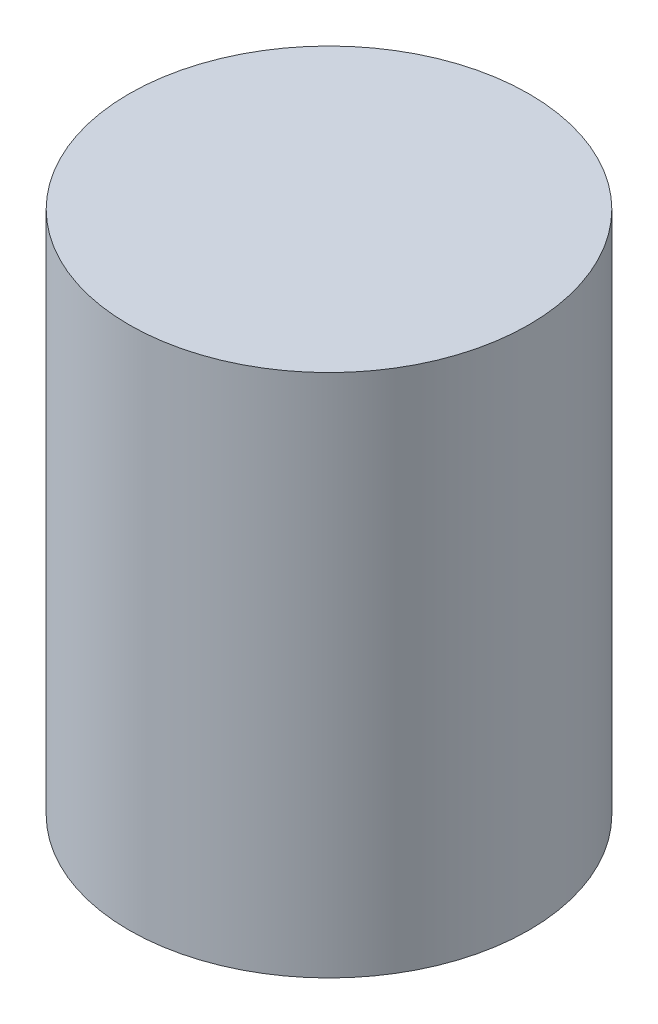
ISO-10303-21;
HEADER;
FILE_DESCRIPTION(('STEP AP214'),'2;1');
FILE_NAME('part.step','',(''),(''),'','','');
FILE_SCHEMA(('AUTOMOTIVE_DESIGN { 1 0 10303 214 1 1 1 1 }'));
ENDSEC;
DATA;
#1=APPLICATION_CONTEXT('core data for automotive mechanical design processes');
#2=APPLICATION_PROTOCOL_DEFINITION('international standard','automotive_design',2000,#1);
#3=PRODUCT_CONTEXT('',#1,'mechanical');
#4=PRODUCT('Part','Part','',(#3));
#5=PRODUCT_RELATED_PRODUCT_CATEGORY('part','',(#4));
#6=PRODUCT_DEFINITION_FORMATION('','',#4);
#7=PRODUCT_DEFINITION_CONTEXT('part definition',#1,'design');
#8=PRODUCT_DEFINITION('design','',#6,#7);
#9=PRODUCT_DEFINITION_SHAPE('','',#8);
#10=(LENGTH_UNIT() NAMED_UNIT(*) SI_UNIT(.MILLI.,.METRE.));
#11=(NAMED_UNIT(*) PLANE_ANGLE_UNIT() SI_UNIT($,.RADIAN.));
#12=(NAMED_UNIT(*) SI_UNIT($,.STERADIAN.) SOLID_ANGLE_UNIT());
#13=UNCERTAINTY_MEASURE_WITH_UNIT(LENGTH_MEASURE(1.E-05),#10,'distance_accuracy_value','');
#14=(GEOMETRIC_REPRESENTATION_CONTEXT(3) GLOBAL_UNCERTAINTY_ASSIGNED_CONTEXT((#13)) GLOBAL_UNIT_ASSIGNED_CONTEXT((#10,
#11,#12)) REPRESENTATION_CONTEXT('',''));
#15=CARTESIAN_POINT('',(0.,0.,0.));
#16=DIRECTION('',(0.,0.,1.));
#17=DIRECTION('',(1.,0.,0.));
#18=AXIS2_PLACEMENT_3D('',#15,#16,#17);
#19=CARTESIAN_POINT('',(0.,65.278,0.));
#20=DIRECTION('',(0.,-1.,0.));
#21=DIRECTION('',(0.,0.,-1.));
#22=AXIS2_PLACEMENT_3D('',#19,#20,#21);
#23=CYLINDRICAL_SURFACE('',#22,24.9);
#24=CARTESIAN_POINT('',(0.,65.278,0.));
#25=DIRECTION('',(0.,1.,0.));
#26=DIRECTION('',(0.,0.,1.));
#27=AXIS2_PLACEMENT_3D('',#24,#25,#26);
#28=CIRCLE('',#27,24.9);
#29=CARTESIAN_POINT('',(0.,65.278,24.9));
#30=VERTEX_POINT('',#29);
#31=EDGE_CURVE('E10',#30,#30,#28,.T.);
#32=ORIENTED_EDGE('',*,*,#31,.F.);
#33=EDGE_LOOP('',(#32));
#34=FACE_BOUND('',#33,.T.);
#35=CARTESIAN_POINT('',(0.,0.,0.));
#36=DIRECTION('',(0.,1.,0.));
#37=DIRECTION('',(0.,0.,1.));
#38=AXIS2_PLACEMENT_3D('',#35,#36,#37);
#39=CIRCLE('',#38,24.9);
#40=CARTESIAN_POINT('',(0.,0.,24.9));
#41=VERTEX_POINT('',#40);
#42=EDGE_CURVE('E40',#41,#41,#39,.T.);
#43=ORIENTED_EDGE('',*,*,#42,.T.);
#44=EDGE_LOOP('',(#43));
#45=FACE_BOUND('',#44,.T.);
#46=ADVANCED_FACE('F37',(#34,#45),#23,.T.);
#47=CARTESIAN_POINT('',(0.,65.278,0.));
#48=DIRECTION('',(0.,1.,0.));
#49=DIRECTION('',(0.,0.,1.));
#50=AXIS2_PLACEMENT_3D('',#47,#48,#49);
#51=PLANE('',#50);
#52=ORIENTED_EDGE('',*,*,#31,.T.);
#53=EDGE_LOOP('',(#52));
#54=FACE_BOUND('',#53,.T.);
#55=ADVANCED_FACE('F54',(#54),#51,.T.);
#56=CARTESIAN_POINT('',(0.,0.,0.));
#57=DIRECTION('',(0.,1.,0.));
#58=DIRECTION('',(0.,0.,1.));
#59=AXIS2_PLACEMENT_3D('',#56,#57,#58);
#60=PLANE('',#59);
#61=ORIENTED_EDGE('',*,*,#42,.F.);
#62=EDGE_LOOP('',(#61));
#63=FACE_BOUND('',#62,.T.);
#64=ADVANCED_FACE('F52',(#63),#60,.F.);
#65=CLOSED_SHELL('',(#46,#55,#64));
#66=MANIFOLD_SOLID_BREP('B2',#65);
#67=ADVANCED_BREP_SHAPE_REPRESENTATION('',(#18,#66),#14);
#68=SHAPE_DEFINITION_REPRESENTATION(#9,#67);
ENDSEC;
END-ISO-10303-21;
